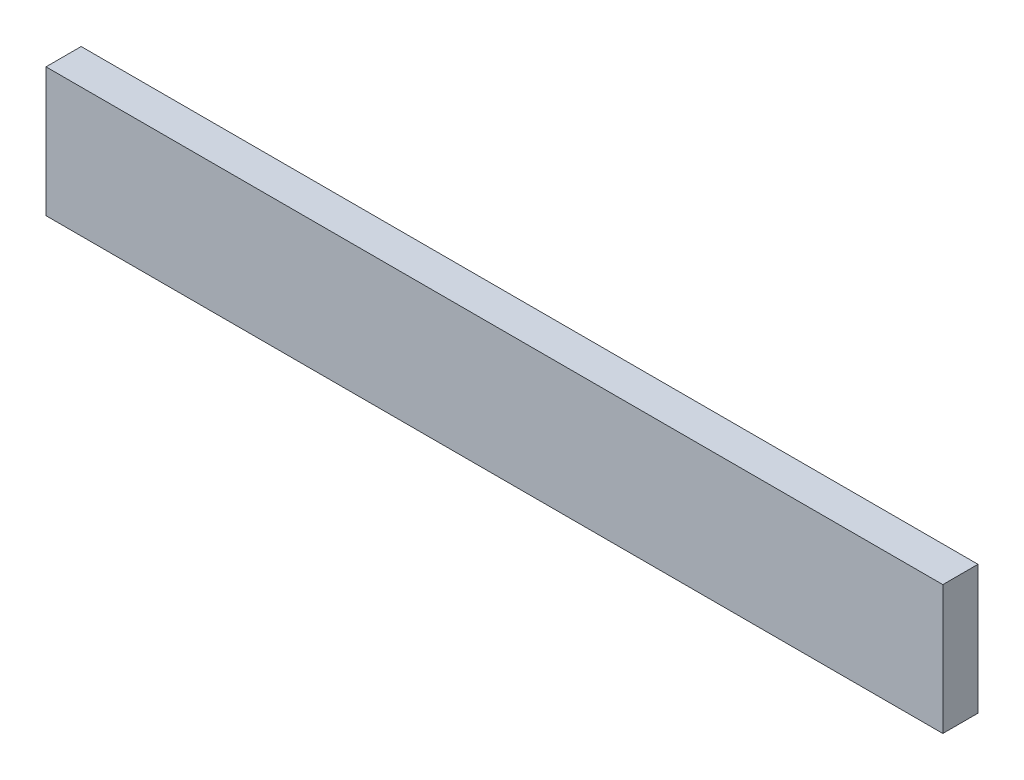
ISO-10303-21;
HEADER;
FILE_DESCRIPTION(('STEP AP214'),'2;1');
FILE_NAME('part.step','',(''),(''),'','','');
FILE_SCHEMA(('AUTOMOTIVE_DESIGN { 1 0 10303 214 1 1 1 1 }'));
ENDSEC;
DATA;
#1=APPLICATION_CONTEXT('core data for automotive mechanical design processes');
#2=APPLICATION_PROTOCOL_DEFINITION('international standard','automotive_design',2000,#1);
#3=PRODUCT_CONTEXT('',#1,'mechanical');
#4=PRODUCT('Part','Part','',(#3));
#5=PRODUCT_RELATED_PRODUCT_CATEGORY('part','',(#4));
#6=PRODUCT_DEFINITION_FORMATION('','',#4);
#7=PRODUCT_DEFINITION_CONTEXT('part definition',#1,'design');
#8=PRODUCT_DEFINITION('design','',#6,#7);
#9=PRODUCT_DEFINITION_SHAPE('','',#8);
#10=(LENGTH_UNIT() NAMED_UNIT(*) SI_UNIT(.MILLI.,.METRE.));
#11=(NAMED_UNIT(*) PLANE_ANGLE_UNIT() SI_UNIT($,.RADIAN.));
#12=(NAMED_UNIT(*) SI_UNIT($,.STERADIAN.) SOLID_ANGLE_UNIT());
#13=UNCERTAINTY_MEASURE_WITH_UNIT(LENGTH_MEASURE(1.E-05),#10,'distance_accuracy_value','');
#14=(GEOMETRIC_REPRESENTATION_CONTEXT(3) GLOBAL_UNCERTAINTY_ASSIGNED_CONTEXT((#13)) GLOBAL_UNIT_ASSIGNED_CONTEXT((#10,
#11,#12)) REPRESENTATION_CONTEXT('',''));
#15=CARTESIAN_POINT('',(0.,0.,0.));
#16=DIRECTION('',(0.,0.,1.));
#17=DIRECTION('',(1.,0.,0.));
#18=AXIS2_PLACEMENT_3D('',#15,#16,#17);
#19=CARTESIAN_POINT('',(0.,22.,6.));
#20=DIRECTION('',(1.,0.,0.));
#21=DIRECTION('',(0.,0.,-1.));
#22=AXIS2_PLACEMENT_3D('',#19,#20,#21);
#23=PLANE('',#22);
#24=DIRECTION('',(0.,-1.,0.));
#25=VECTOR('',#24,1.);
#26=CARTESIAN_POINT('',(0.,22.,0.));
#27=LINE('',#26,#25);
#28=CARTESIAN_POINT('',(0.,22.,0.));
#29=VERTEX_POINT('',#28);
#30=CARTESIAN_POINT('',(0.,0.,0.));
#31=VERTEX_POINT('',#30);
#32=EDGE_CURVE('E102',#29,#31,#27,.T.);
#33=ORIENTED_EDGE('',*,*,#32,.T.);
#34=DIRECTION('',(0.,0.,-1.));
#35=VECTOR('',#34,1.);
#36=CARTESIAN_POINT('',(0.,0.,6.));
#37=LINE('',#36,#35);
#38=CARTESIAN_POINT('',(0.,0.,6.));
#39=VERTEX_POINT('',#38);
#40=EDGE_CURVE('E11',#39,#31,#37,.T.);
#41=ORIENTED_EDGE('',*,*,#40,.F.);
#42=DIRECTION('',(0.,-1.,0.));
#43=VECTOR('',#42,1.);
#44=CARTESIAN_POINT('',(0.,22.,6.));
#45=LINE('',#44,#43);
#46=CARTESIAN_POINT('',(0.,22.,6.));
#47=VERTEX_POINT('',#46);
#48=EDGE_CURVE('E90',#47,#39,#45,.T.);
#49=ORIENTED_EDGE('',*,*,#48,.F.);
#50=DIRECTION('',(0.,0.,-1.));
#51=VECTOR('',#50,1.);
#52=CARTESIAN_POINT('',(0.,22.,6.));
#53=LINE('',#52,#51);
#54=EDGE_CURVE('E98',#47,#29,#53,.T.);
#55=ORIENTED_EDGE('',*,*,#54,.T.);
#56=EDGE_LOOP('',(#33,#41,#49,#55));
#57=FACE_BOUND('',#56,.T.);
#58=ADVANCED_FACE('F39',(#57),#23,.F.);
#59=CARTESIAN_POINT('',(0.,0.,6.));
#60=DIRECTION('',(0.,1.,0.));
#61=DIRECTION('',(0.,0.,1.));
#62=AXIS2_PLACEMENT_3D('',#59,#60,#61);
#63=PLANE('',#62);
#64=DIRECTION('',(1.,0.,0.));
#65=VECTOR('',#64,1.);
#66=CARTESIAN_POINT('',(0.,0.,0.));
#67=LINE('',#66,#65);
#68=CARTESIAN_POINT('',(153.,0.,0.));
#69=VERTEX_POINT('',#68);
#70=EDGE_CURVE('E94',#31,#69,#67,.T.);
#71=ORIENTED_EDGE('',*,*,#70,.T.);
#72=DIRECTION('',(0.,0.,-1.));
#73=VECTOR('',#72,1.);
#74=CARTESIAN_POINT('',(153.,0.,6.));
#75=LINE('',#74,#73);
#76=CARTESIAN_POINT('',(153.,0.,6.));
#77=VERTEX_POINT('',#76);
#78=EDGE_CURVE('E47',#77,#69,#75,.T.);
#79=ORIENTED_EDGE('',*,*,#78,.F.);
#80=DIRECTION('',(1.,0.,0.));
#81=VECTOR('',#80,1.);
#82=CARTESIAN_POINT('',(0.,0.,6.));
#83=LINE('',#82,#81);
#84=EDGE_CURVE('E85',#39,#77,#83,.T.);
#85=ORIENTED_EDGE('',*,*,#84,.F.);
#86=ORIENTED_EDGE('',*,*,#40,.T.);
#87=EDGE_LOOP('',(#71,#79,#85,#86));
#88=FACE_BOUND('',#87,.T.);
#89=ADVANCED_FACE('F93',(#88),#63,.F.);
#90=CARTESIAN_POINT('',(153.,0.,6.));
#91=DIRECTION('',(-1.,0.,0.));
#92=DIRECTION('',(0.,0.,1.));
#93=AXIS2_PLACEMENT_3D('',#90,#91,#92);
#94=PLANE('',#93);
#95=DIRECTION('',(0.,1.,0.));
#96=VECTOR('',#95,1.);
#97=CARTESIAN_POINT('',(153.,0.,0.));
#98=LINE('',#97,#96);
#99=CARTESIAN_POINT('',(153.,22.,0.));
#100=VERTEX_POINT('',#99);
#101=EDGE_CURVE('E72',#69,#100,#98,.T.);
#102=ORIENTED_EDGE('',*,*,#101,.T.);
#103=DIRECTION('',(0.,0.,-1.));
#104=VECTOR('',#103,1.);
#105=CARTESIAN_POINT('',(153.,22.,6.));
#106=LINE('',#105,#104);
#107=CARTESIAN_POINT('',(153.,22.,6.));
#108=VERTEX_POINT('',#107);
#109=EDGE_CURVE('E95',#108,#100,#106,.T.);
#110=ORIENTED_EDGE('',*,*,#109,.F.);
#111=DIRECTION('',(0.,1.,0.));
#112=VECTOR('',#111,1.);
#113=CARTESIAN_POINT('',(153.,0.,6.));
#114=LINE('',#113,#112);
#115=EDGE_CURVE('E88',#77,#108,#114,.T.);
#116=ORIENTED_EDGE('',*,*,#115,.F.);
#117=ORIENTED_EDGE('',*,*,#78,.T.);
#118=EDGE_LOOP('',(#102,#110,#116,#117));
#119=FACE_BOUND('',#118,.T.);
#120=ADVANCED_FACE('F96',(#119),#94,.F.);
#121=CARTESIAN_POINT('',(153.,22.,6.));
#122=DIRECTION('',(0.,-1.,0.));
#123=DIRECTION('',(0.,0.,-1.));
#124=AXIS2_PLACEMENT_3D('',#121,#122,#123);
#125=PLANE('',#124);
#126=DIRECTION('',(-1.,0.,0.));
#127=VECTOR('',#126,1.);
#128=CARTESIAN_POINT('',(153.,22.,0.));
#129=LINE('',#128,#127);
#130=EDGE_CURVE('E78',#100,#29,#129,.T.);
#131=ORIENTED_EDGE('',*,*,#130,.T.);
#132=ORIENTED_EDGE('',*,*,#54,.F.);
#133=DIRECTION('',(-1.,0.,0.));
#134=VECTOR('',#133,1.);
#135=CARTESIAN_POINT('',(153.,22.,6.));
#136=LINE('',#135,#134);
#137=EDGE_CURVE('E55',#108,#47,#136,.T.);
#138=ORIENTED_EDGE('',*,*,#137,.F.);
#139=ORIENTED_EDGE('',*,*,#109,.T.);
#140=EDGE_LOOP('',(#131,#132,#138,#139));
#141=FACE_BOUND('',#140,.T.);
#142=ADVANCED_FACE('F109',(#141),#125,.F.);
#143=CARTESIAN_POINT('',(0.,0.,6.));
#144=DIRECTION('',(0.,0.,1.));
#145=DIRECTION('',(1.,0.,0.));
#146=AXIS2_PLACEMENT_3D('',#143,#144,#145);
#147=PLANE('',#146);
#148=ORIENTED_EDGE('',*,*,#48,.T.);
#149=ORIENTED_EDGE('',*,*,#84,.T.);
#150=ORIENTED_EDGE('',*,*,#115,.T.);
#151=ORIENTED_EDGE('',*,*,#137,.T.);
#152=EDGE_LOOP('',(#148,#149,#150,#151));
#153=FACE_BOUND('',#152,.T.);
#154=ADVANCED_FACE('F86',(#153),#147,.T.);
#155=CARTESIAN_POINT('',(0.,0.,0.));
#156=DIRECTION('',(0.,0.,1.));
#157=DIRECTION('',(1.,0.,0.));
#158=AXIS2_PLACEMENT_3D('',#155,#156,#157);
#159=PLANE('',#158);
#160=ORIENTED_EDGE('',*,*,#32,.F.);
#161=ORIENTED_EDGE('',*,*,#130,.F.);
#162=ORIENTED_EDGE('',*,*,#101,.F.);
#163=ORIENTED_EDGE('',*,*,#70,.F.);
#164=EDGE_LOOP('',(#160,#161,#162,#163));
#165=FACE_BOUND('',#164,.T.);
#166=ADVANCED_FACE('F112',(#165),#159,.F.);
#167=CLOSED_SHELL('',(#58,#89,#120,#142,#154,#166));
#168=MANIFOLD_SOLID_BREP('B2',#167);
#169=ADVANCED_BREP_SHAPE_REPRESENTATION('',(#18,#168),#14);
#170=SHAPE_DEFINITION_REPRESENTATION(#9,#169);
ENDSEC;
END-ISO-10303-21;
